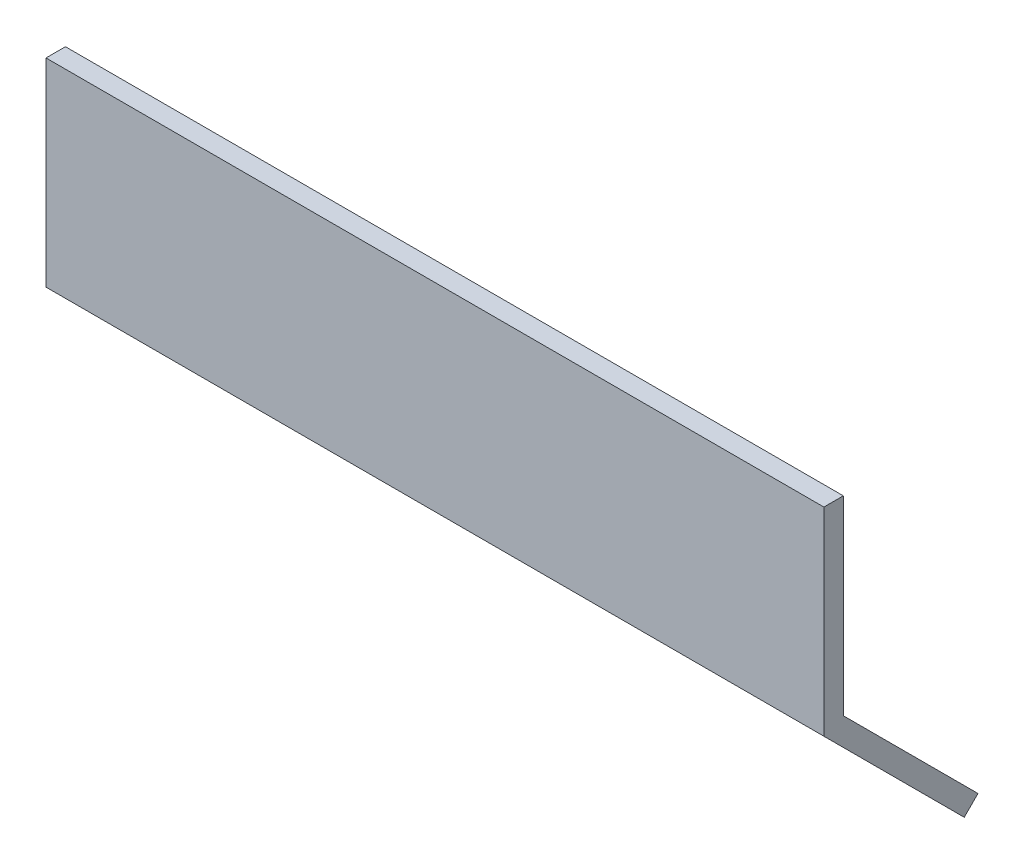
ISO-10303-21;
HEADER;
FILE_DESCRIPTION(('STEP AP214'),'2;1');
FILE_NAME('part.step','',(''),(''),'','','');
FILE_SCHEMA(('AUTOMOTIVE_DESIGN { 1 0 10303 214 1 1 1 1 }'));
ENDSEC;
DATA;
#1=APPLICATION_CONTEXT('core data for automotive mechanical design processes');
#2=APPLICATION_PROTOCOL_DEFINITION('international standard','automotive_design',2000,#1);
#3=PRODUCT_CONTEXT('',#1,'mechanical');
#4=PRODUCT('Part','Part','',(#3));
#5=PRODUCT_RELATED_PRODUCT_CATEGORY('part','',(#4));
#6=PRODUCT_DEFINITION_FORMATION('','',#4);
#7=PRODUCT_DEFINITION_CONTEXT('part definition',#1,'design');
#8=PRODUCT_DEFINITION('design','',#6,#7);
#9=PRODUCT_DEFINITION_SHAPE('','',#8);
#10=(LENGTH_UNIT() NAMED_UNIT(*) SI_UNIT(.MILLI.,.METRE.));
#11=(NAMED_UNIT(*) PLANE_ANGLE_UNIT() SI_UNIT($,.RADIAN.));
#12=(NAMED_UNIT(*) SI_UNIT($,.STERADIAN.) SOLID_ANGLE_UNIT());
#13=UNCERTAINTY_MEASURE_WITH_UNIT(LENGTH_MEASURE(1.E-05),#10,'distance_accuracy_value','');
#14=(GEOMETRIC_REPRESENTATION_CONTEXT(3) GLOBAL_UNCERTAINTY_ASSIGNED_CONTEXT((#13)) GLOBAL_UNIT_ASSIGNED_CONTEXT((#10,
#11,#12)) REPRESENTATION_CONTEXT('',''));
#15=CARTESIAN_POINT('',(0.,0.,0.));
#16=DIRECTION('',(0.,0.,1.));
#17=DIRECTION('',(1.,0.,0.));
#18=AXIS2_PLACEMENT_3D('',#15,#16,#17);
#19=CARTESIAN_POINT('',(200.,-1.76776695296637,1.76776695296637));
#20=DIRECTION('',(0.,0.707106781186549,-0.707106781186546));
#21=DIRECTION('',(0.,0.707106781186546,0.707106781186549));
#22=AXIS2_PLACEMENT_3D('',#19,#20,#21);
#23=PLANE('',#22);
#24=CARTESIAN_POINT('',(132.,-31.4662517628013,-27.9307178568687));
#25=DIRECTION('',(0.,0.707106781186549,-0.707106781186546));
#26=DIRECTION('',(0.,0.707106781186546,0.707106781186549));
#27=AXIS2_PLACEMENT_3D('',#24,#25,#26);
#28=CIRCLE('',#27,1.5);
#29=CARTESIAN_POINT('',(132.,-30.4055915910215,-26.8700576850889));
#30=VERTEX_POINT('',#29);
#31=EDGE_CURVE('E134',#30,#30,#28,.F.);
#32=ORIENTED_EDGE('',*,*,#31,.F.);
#33=EDGE_LOOP('',(#32));
#34=FACE_BOUND('',#33,.T.);
#35=CARTESIAN_POINT('',(196.,-31.4662517628013,-27.9307178568687));
#36=DIRECTION('',(0.,0.707106781186549,-0.707106781186546));
#37=DIRECTION('',(0.,0.707106781186546,0.707106781186549));
#38=AXIS2_PLACEMENT_3D('',#35,#36,#37);
#39=CIRCLE('',#38,1.5);
#40=CARTESIAN_POINT('',(196.,-30.4055915910215,-26.8700576850889));
#41=VERTEX_POINT('',#40);
#42=EDGE_CURVE('E186',#41,#41,#39,.F.);
#43=ORIENTED_EDGE('',*,*,#42,.F.);
#44=EDGE_LOOP('',(#43));
#45=FACE_BOUND('',#44,.T.);
#46=DIRECTION('',(0.,-0.707106781186546,-0.707106781186549));
#47=VECTOR('',#46,1.);
#48=CARTESIAN_POINT('',(0.,-1.76776695296637,1.76776695296637));
#49=LINE('',#48,#47);
#50=CARTESIAN_POINT('',(0.,-1.03553390593274,2.5));
#51=VERTEX_POINT('',#50);
#52=CARTESIAN_POINT('',(0.,-37.1231060122937,-33.5875721063611));
#53=VERTEX_POINT('',#52);
#54=EDGE_CURVE('E129',#51,#53,#49,.T.);
#55=ORIENTED_EDGE('',*,*,#54,.T.);
#56=DIRECTION('',(-1.,0.,0.));
#57=VECTOR('',#56,1.);
#58=CARTESIAN_POINT('',(200.,-37.1231060122937,-33.5875721063611));
#59=LINE('',#58,#57);
#60=CARTESIAN_POINT('',(200.,-37.1231060122937,-33.5875721063611));
#61=VERTEX_POINT('',#60);
#62=EDGE_CURVE('E11',#61,#53,#59,.T.);
#63=ORIENTED_EDGE('',*,*,#62,.F.);
#64=DIRECTION('',(0.,-0.707106781186546,-0.707106781186549));
#65=VECTOR('',#64,1.);
#66=CARTESIAN_POINT('',(200.,-1.76776695296637,1.76776695296637));
#67=LINE('',#66,#65);
#68=CARTESIAN_POINT('',(200.,-1.03553390593274,2.5));
#69=VERTEX_POINT('',#68);
#70=EDGE_CURVE('E90',#69,#61,#67,.T.);
#71=ORIENTED_EDGE('',*,*,#70,.F.);
#72=DIRECTION('',(-1.,0.,0.));
#73=VECTOR('',#72,1.);
#74=CARTESIAN_POINT('',(200.,-1.03553390593274,2.5));
#75=LINE('',#74,#73);
#76=EDGE_CURVE('E125',#69,#51,#75,.T.);
#77=ORIENTED_EDGE('',*,*,#76,.T.);
#78=EDGE_LOOP('',(#55,#63,#71,#77));
#79=FACE_BOUND('',#78,.T.);
#80=ADVANCED_FACE('F43',(#34,#45,#79),#23,.F.);
#81=CARTESIAN_POINT('',(200.,-33.5875721063609,-37.1231060122938));
#82=DIRECTION('',(0.,-0.707106781186546,-0.707106781186549));
#83=DIRECTION('',(0.,0.707106781186549,-0.707106781186546));
#84=AXIS2_PLACEMENT_3D('',#81,#82,#83);
#85=PLANE('',#84);
#86=DIRECTION('',(0.,-0.707106781186549,0.707106781186546));
#87=VECTOR('',#86,1.);
#88=CARTESIAN_POINT('',(0.,-33.5875721063609,-37.1231060122938));
#89=LINE('',#88,#87);
#90=CARTESIAN_POINT('',(0.,-33.5875721063609,-37.1231060122938));
#91=VERTEX_POINT('',#90);
#92=EDGE_CURVE('E133',#91,#53,#89,.T.);
#93=ORIENTED_EDGE('',*,*,#92,.F.);
#94=DIRECTION('',(-1.,0.,0.));
#95=VECTOR('',#94,1.);
#96=CARTESIAN_POINT('',(200.,-33.5875721063609,-37.1231060122938));
#97=LINE('',#96,#95);
#98=CARTESIAN_POINT('',(200.,-33.5875721063609,-37.1231060122938));
#99=VERTEX_POINT('',#98);
#100=EDGE_CURVE('E52',#99,#91,#97,.T.);
#101=ORIENTED_EDGE('',*,*,#100,.F.);
#102=DIRECTION('',(0.,-0.707106781186549,0.707106781186546));
#103=VECTOR('',#102,1.);
#104=CARTESIAN_POINT('',(200.,-33.5875721063609,-37.1231060122938));
#105=LINE('',#104,#103);
#106=EDGE_CURVE('E200',#99,#61,#105,.T.);
#107=ORIENTED_EDGE('',*,*,#106,.T.);
#108=ORIENTED_EDGE('',*,*,#62,.T.);
#109=EDGE_LOOP('',(#93,#101,#107,#108));
#110=FACE_BOUND('',#109,.T.);
#111=ADVANCED_FACE('F161',(#110),#85,.T.);
#112=CARTESIAN_POINT('',(200.,1.76776695296637,-1.76776695296637));
#113=DIRECTION('',(0.,0.707106781186549,-0.707106781186546));
#114=DIRECTION('',(0.,0.707106781186546,0.707106781186549));
#115=AXIS2_PLACEMENT_3D('',#112,#113,#114);
#116=PLANE('',#115);
#117=CARTESIAN_POINT('',(132.,-27.9307178568686,-31.4662517628014));
#118=DIRECTION('',(0.,0.707106781186549,-0.707106781186546));
#119=DIRECTION('',(0.,0.707106781186546,0.707106781186549));
#120=AXIS2_PLACEMENT_3D('',#117,#118,#119);
#121=CIRCLE('',#120,1.5);
#122=CARTESIAN_POINT('',(132.,-26.8700576850888,-30.4055915910216));
#123=VERTEX_POINT('',#122);
#124=EDGE_CURVE('E193',#123,#123,#121,.T.);
#125=ORIENTED_EDGE('',*,*,#124,.F.);
#126=EDGE_LOOP('',(#125));
#127=FACE_BOUND('',#126,.T.);
#128=CARTESIAN_POINT('',(196.,-27.9307178568686,-31.4662517628014));
#129=DIRECTION('',(0.,0.707106781186549,-0.707106781186546));
#130=DIRECTION('',(0.,0.707106781186546,0.707106781186549));
#131=AXIS2_PLACEMENT_3D('',#128,#129,#130);
#132=CIRCLE('',#131,1.5);
#133=CARTESIAN_POINT('',(196.,-26.8700576850887,-30.4055915910216));
#134=VERTEX_POINT('',#133);
#135=EDGE_CURVE('E189',#134,#134,#132,.T.);
#136=ORIENTED_EDGE('',*,*,#135,.F.);
#137=EDGE_LOOP('',(#136));
#138=FACE_BOUND('',#137,.T.);
#139=DIRECTION('',(0.,-0.707106781186546,-0.707106781186549));
#140=VECTOR('',#139,1.);
#141=CARTESIAN_POINT('',(0.,1.76776695296637,-1.76776695296637));
#142=LINE('',#141,#140);
#143=CARTESIAN_POINT('',(0.,1.03553390593274,-2.5));
#144=VERTEX_POINT('',#143);
#145=EDGE_CURVE('E138',#144,#91,#142,.T.);
#146=ORIENTED_EDGE('',*,*,#145,.F.);
#147=DIRECTION('',(-1.,0.,0.));
#148=VECTOR('',#147,1.);
#149=CARTESIAN_POINT('',(200.,1.03553390593274,-2.5));
#150=LINE('',#149,#148);
#151=CARTESIAN_POINT('',(200.,1.03553390593274,-2.5));
#152=VERTEX_POINT('',#151);
#153=EDGE_CURVE('E112',#152,#144,#150,.T.);
#154=ORIENTED_EDGE('',*,*,#153,.F.);
#155=DIRECTION('',(0.,-0.707106781186546,-0.707106781186549));
#156=VECTOR('',#155,1.);
#157=CARTESIAN_POINT('',(200.,1.76776695296637,-1.76776695296637));
#158=LINE('',#157,#156);
#159=EDGE_CURVE('E118',#152,#99,#158,.T.);
#160=ORIENTED_EDGE('',*,*,#159,.T.);
#161=ORIENTED_EDGE('',*,*,#100,.T.);
#162=EDGE_LOOP('',(#146,#154,#160,#161));
#163=FACE_BOUND('',#162,.T.);
#164=ADVANCED_FACE('F158',(#127,#138,#163),#116,.T.);
#165=CARTESIAN_POINT('',(200.,50.,-2.5));
#166=DIRECTION('',(0.,0.,-1.));
#167=DIRECTION('',(-1.,0.,0.));
#168=AXIS2_PLACEMENT_3D('',#165,#166,#167);
#169=PLANE('',#168);
#170=DIRECTION('',(0.,1.,0.));
#171=VECTOR('',#170,1.);
#172=CARTESIAN_POINT('',(0.,50.,-2.5));
#173=LINE('',#172,#171);
#174=CARTESIAN_POINT('',(0.,50.,-2.5));
#175=VERTEX_POINT('',#174);
#176=EDGE_CURVE('E106',#175,#144,#173,.F.);
#177=ORIENTED_EDGE('',*,*,#176,.F.);
#178=DIRECTION('',(-1.,0.,0.));
#179=VECTOR('',#178,1.);
#180=CARTESIAN_POINT('',(200.,50.,-2.5));
#181=LINE('',#180,#179);
#182=CARTESIAN_POINT('',(200.,50.,-2.5));
#183=VERTEX_POINT('',#182);
#184=EDGE_CURVE('E101',#183,#175,#181,.T.);
#185=ORIENTED_EDGE('',*,*,#184,.F.);
#186=DIRECTION('',(0.,1.,0.));
#187=VECTOR('',#186,1.);
#188=CARTESIAN_POINT('',(200.,50.,-2.5));
#189=LINE('',#188,#187);
#190=EDGE_CURVE('E104',#183,#152,#189,.F.);
#191=ORIENTED_EDGE('',*,*,#190,.T.);
#192=ORIENTED_EDGE('',*,*,#153,.T.);
#193=EDGE_LOOP('',(#177,#185,#191,#192));
#194=FACE_BOUND('',#193,.T.);
#195=ADVANCED_FACE('F103',(#194),#169,.T.);
#196=CARTESIAN_POINT('',(200.,50.,2.5));
#197=DIRECTION('',(0.,1.,0.));
#198=DIRECTION('',(0.,0.,1.));
#199=AXIS2_PLACEMENT_3D('',#196,#197,#198);
#200=PLANE('',#199);
#201=DIRECTION('',(0.,0.,-1.));
#202=VECTOR('',#201,1.);
#203=CARTESIAN_POINT('',(0.,50.,2.5));
#204=LINE('',#203,#202);
#205=CARTESIAN_POINT('',(0.,50.,2.5));
#206=VERTEX_POINT('',#205);
#207=EDGE_CURVE('E144',#206,#175,#204,.T.);
#208=ORIENTED_EDGE('',*,*,#207,.F.);
#209=DIRECTION('',(-1.,0.,0.));
#210=VECTOR('',#209,1.);
#211=CARTESIAN_POINT('',(200.,50.,2.5));
#212=LINE('',#211,#210);
#213=CARTESIAN_POINT('',(200.,50.,2.5));
#214=VERTEX_POINT('',#213);
#215=EDGE_CURVE('E81',#214,#206,#212,.T.);
#216=ORIENTED_EDGE('',*,*,#215,.F.);
#217=DIRECTION('',(0.,0.,-1.));
#218=VECTOR('',#217,1.);
#219=CARTESIAN_POINT('',(200.,50.,2.5));
#220=LINE('',#219,#218);
#221=EDGE_CURVE('E116',#214,#183,#220,.T.);
#222=ORIENTED_EDGE('',*,*,#221,.T.);
#223=ORIENTED_EDGE('',*,*,#184,.T.);
#224=EDGE_LOOP('',(#208,#216,#222,#223));
#225=FACE_BOUND('',#224,.T.);
#226=ADVANCED_FACE('F121',(#225),#200,.T.);
#227=CARTESIAN_POINT('',(200.,50.,2.5));
#228=DIRECTION('',(0.,0.,-1.));
#229=DIRECTION('',(-1.,0.,0.));
#230=AXIS2_PLACEMENT_3D('',#227,#228,#229);
#231=PLANE('',#230);
#232=DIRECTION('',(0.,1.,0.));
#233=VECTOR('',#232,1.);
#234=CARTESIAN_POINT('',(0.,50.,2.5));
#235=LINE('',#234,#233);
#236=EDGE_CURVE('E84',#206,#51,#235,.F.);
#237=ORIENTED_EDGE('',*,*,#236,.T.);
#238=ORIENTED_EDGE('',*,*,#76,.F.);
#239=DIRECTION('',(0.,1.,0.));
#240=VECTOR('',#239,1.);
#241=CARTESIAN_POINT('',(200.,50.,2.5));
#242=LINE('',#241,#240);
#243=EDGE_CURVE('E60',#214,#69,#242,.F.);
#244=ORIENTED_EDGE('',*,*,#243,.F.);
#245=ORIENTED_EDGE('',*,*,#215,.T.);
#246=EDGE_LOOP('',(#237,#238,#244,#245));
#247=FACE_BOUND('',#246,.T.);
#248=ADVANCED_FACE('F166',(#247),#231,.F.);
#249=CARTESIAN_POINT('',(200.,0.,0.));
#250=DIRECTION('',(-1.,0.,0.));
#251=DIRECTION('',(0.,0.,1.));
#252=AXIS2_PLACEMENT_3D('',#249,#250,#251);
#253=PLANE('',#252);
#254=ORIENTED_EDGE('',*,*,#70,.T.);
#255=ORIENTED_EDGE('',*,*,#106,.F.);
#256=ORIENTED_EDGE('',*,*,#159,.F.);
#257=ORIENTED_EDGE('',*,*,#190,.F.);
#258=ORIENTED_EDGE('',*,*,#221,.F.);
#259=ORIENTED_EDGE('',*,*,#243,.T.);
#260=EDGE_LOOP('',(#254,#255,#256,#257,#258,#259));
#261=FACE_BOUND('',#260,.T.);
#262=ADVANCED_FACE('F115',(#261),#253,.F.);
#263=CARTESIAN_POINT('',(0.,0.,0.));
#264=DIRECTION('',(-1.,0.,0.));
#265=DIRECTION('',(0.,0.,1.));
#266=AXIS2_PLACEMENT_3D('',#263,#264,#265);
#267=PLANE('',#266);
#268=ORIENTED_EDGE('',*,*,#54,.F.);
#269=ORIENTED_EDGE('',*,*,#236,.F.);
#270=ORIENTED_EDGE('',*,*,#207,.T.);
#271=ORIENTED_EDGE('',*,*,#176,.T.);
#272=ORIENTED_EDGE('',*,*,#145,.T.);
#273=ORIENTED_EDGE('',*,*,#92,.T.);
#274=EDGE_LOOP('',(#268,#269,#270,#271,#272,#273));
#275=FACE_BOUND('',#274,.T.);
#276=ADVANCED_FACE('F164',(#275),#267,.T.);
#277=CARTESIAN_POINT('',(196.,-49.5110378159818,-9.88593180368822));
#278=DIRECTION('',(0.,0.707106781186549,-0.707106781186546));
#279=DIRECTION('',(0.,0.707106781186546,0.707106781186549));
#280=AXIS2_PLACEMENT_3D('',#277,#278,#279);
#281=CYLINDRICAL_SURFACE('',#280,1.5);
#282=ORIENTED_EDGE('',*,*,#135,.T.);
#283=EDGE_LOOP('',(#282));
#284=FACE_BOUND('',#283,.T.);
#285=ORIENTED_EDGE('',*,*,#42,.T.);
#286=EDGE_LOOP('',(#285));
#287=FACE_BOUND('',#286,.T.);
#288=ADVANCED_FACE('F216',(#284,#287),#281,.F.);
#289=CARTESIAN_POINT('',(132.,-49.5110378159819,-9.88593180368822));
#290=DIRECTION('',(0.,0.707106781186549,-0.707106781186546));
#291=DIRECTION('',(0.,0.707106781186546,0.707106781186549));
#292=AXIS2_PLACEMENT_3D('',#289,#290,#291);
#293=CYLINDRICAL_SURFACE('',#292,1.5);
#294=ORIENTED_EDGE('',*,*,#124,.T.);
#295=EDGE_LOOP('',(#294));
#296=FACE_BOUND('',#295,.T.);
#297=ORIENTED_EDGE('',*,*,#31,.T.);
#298=EDGE_LOOP('',(#297));
#299=FACE_BOUND('',#298,.T.);
#300=ADVANCED_FACE('F208',(#296,#299),#293,.F.);
#301=CLOSED_SHELL('',(#80,#111,#164,#195,#226,#248,#262,#276,#288,#300));
#302=MANIFOLD_SOLID_BREP('B2',#301);
#303=ADVANCED_BREP_SHAPE_REPRESENTATION('',(#18,#302),#14);
#304=SHAPE_DEFINITION_REPRESENTATION(#9,#303);
ENDSEC;
END-ISO-10303-21;
